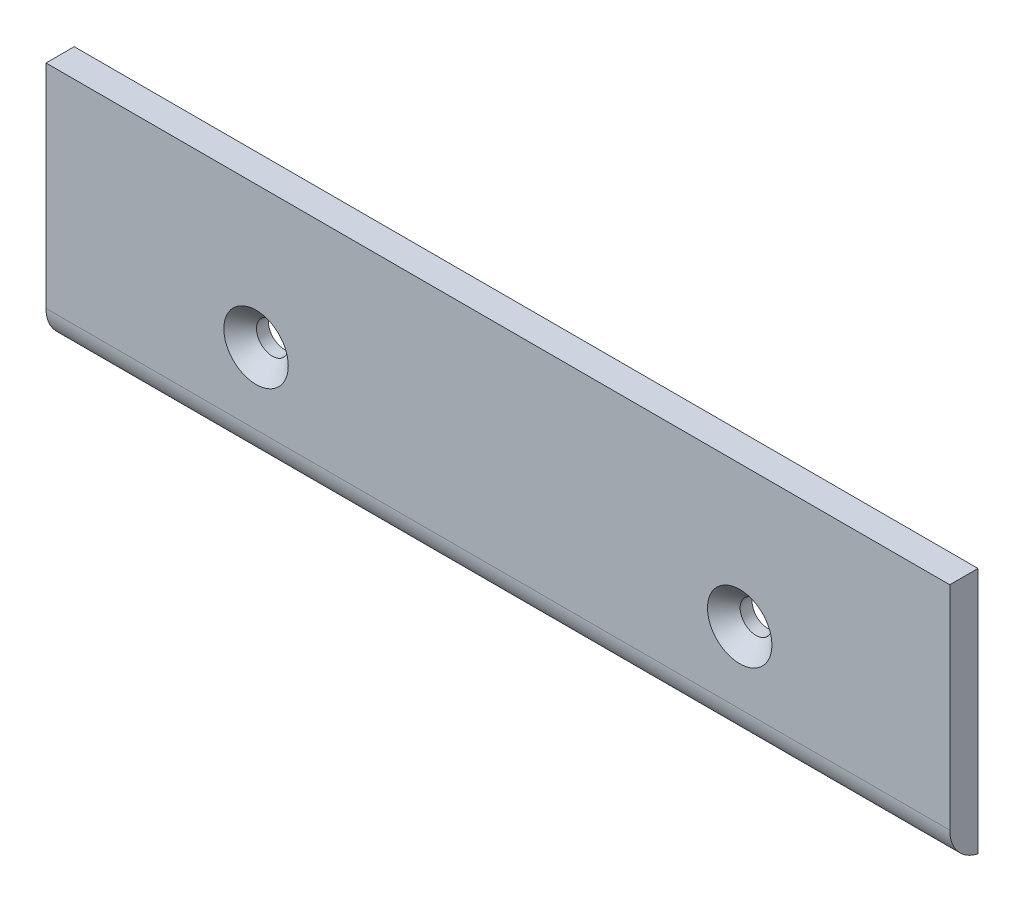
ISO-10303-21;
HEADER;
FILE_DESCRIPTION(('STEP AP214'),'2;1');
FILE_NAME('part.step','',(''),(''),'','','');
FILE_SCHEMA(('AUTOMOTIVE_DESIGN { 1 0 10303 214 1 1 1 1 }'));
ENDSEC;
DATA;
#1=APPLICATION_CONTEXT('core data for automotive mechanical design processes');
#2=APPLICATION_PROTOCOL_DEFINITION('international standard','automotive_design',2000,#1);
#3=PRODUCT_CONTEXT('',#1,'mechanical');
#4=PRODUCT('Part','Part','',(#3));
#5=PRODUCT_RELATED_PRODUCT_CATEGORY('part','',(#4));
#6=PRODUCT_DEFINITION_FORMATION('','',#4);
#7=PRODUCT_DEFINITION_CONTEXT('part definition',#1,'design');
#8=PRODUCT_DEFINITION('design','',#6,#7);
#9=PRODUCT_DEFINITION_SHAPE('','',#8);
#10=(LENGTH_UNIT() NAMED_UNIT(*) SI_UNIT(.MILLI.,.METRE.));
#11=(NAMED_UNIT(*) PLANE_ANGLE_UNIT() SI_UNIT($,.RADIAN.));
#12=(NAMED_UNIT(*) SI_UNIT($,.STERADIAN.) SOLID_ANGLE_UNIT());
#13=UNCERTAINTY_MEASURE_WITH_UNIT(LENGTH_MEASURE(1.E-05),#10,'distance_accuracy_value','');
#14=(GEOMETRIC_REPRESENTATION_CONTEXT(3) GLOBAL_UNCERTAINTY_ASSIGNED_CONTEXT((#13)) GLOBAL_UNIT_ASSIGNED_CONTEXT((#10,
#11,#12)) REPRESENTATION_CONTEXT('',''));
#15=CARTESIAN_POINT('',(0.,0.,0.));
#16=DIRECTION('',(0.,0.,1.));
#17=DIRECTION('',(1.,0.,0.));
#18=AXIS2_PLACEMENT_3D('',#15,#16,#17);
#19=CARTESIAN_POINT('',(-128.,-35.,-4.));
#20=DIRECTION('',(1.,0.,0.));
#21=DIRECTION('',(0.,-1.,0.));
#22=AXIS2_PLACEMENT_3D('',#19,#20,#21);
#23=PLANE('',#22);
#24=DIRECTION('',(0.,-1.,0.));
#25=VECTOR('',#24,1.);
#26=CARTESIAN_POINT('',(-128.,-35.,-4.));
#27=LINE('',#26,#25);
#28=CARTESIAN_POINT('',(-128.,35.,-4.));
#29=VERTEX_POINT('',#28);
#30=CARTESIAN_POINT('',(-128.,-35.,-4.));
#31=VERTEX_POINT('',#30);
#32=EDGE_CURVE('E99',#29,#31,#27,.T.);
#33=ORIENTED_EDGE('',*,*,#32,.T.);
#34=CARTESIAN_POINT('',(-128.,-25.2020410288673,-6.));
#35=DIRECTION('',(1.,0.,0.));
#36=DIRECTION('',(0.,0.,-1.));
#37=AXIS2_PLACEMENT_3D('',#34,#35,#36);
#38=CIRCLE('',#37,10.);
#39=CARTESIAN_POINT('',(-128.,-25.2020410288673,4.));
#40=VERTEX_POINT('',#39);
#41=EDGE_CURVE('E11',#31,#40,#38,.F.);
#42=ORIENTED_EDGE('',*,*,#41,.T.);
#43=DIRECTION('',(0.,1.,0.));
#44=VECTOR('',#43,1.);
#45=CARTESIAN_POINT('',(-128.,0.,4.));
#46=LINE('',#45,#44);
#47=CARTESIAN_POINT('',(-128.,35.,4.));
#48=VERTEX_POINT('',#47);
#49=EDGE_CURVE('E107',#48,#40,#46,.F.);
#50=ORIENTED_EDGE('',*,*,#49,.F.);
#51=DIRECTION('',(0.,0.,-1.));
#52=VECTOR('',#51,1.);
#53=CARTESIAN_POINT('',(-128.,35.,-4.));
#54=LINE('',#53,#52);
#55=EDGE_CURVE('E113',#48,#29,#54,.T.);
#56=ORIENTED_EDGE('',*,*,#55,.T.);
#57=EDGE_LOOP('',(#33,#42,#50,#56));
#58=FACE_BOUND('',#57,.T.);
#59=ADVANCED_FACE('F43',(#58),#23,.F.);
#60=CARTESIAN_POINT('',(-128.,35.,-4.));
#61=DIRECTION('',(0.,-1.,0.));
#62=DIRECTION('',(-1.,0.,0.));
#63=AXIS2_PLACEMENT_3D('',#60,#61,#62);
#64=PLANE('',#63);
#65=ORIENTED_EDGE('',*,*,#55,.F.);
#66=DIRECTION('',(-1.,0.,0.));
#67=VECTOR('',#66,1.);
#68=CARTESIAN_POINT('',(0.,35.,4.));
#69=LINE('',#68,#67);
#70=CARTESIAN_POINT('',(128.,35.,4.));
#71=VERTEX_POINT('',#70);
#72=EDGE_CURVE('E97',#71,#48,#69,.T.);
#73=ORIENTED_EDGE('',*,*,#72,.F.);
#74=DIRECTION('',(0.,0.,-1.));
#75=VECTOR('',#74,1.);
#76=CARTESIAN_POINT('',(128.,35.,-4.));
#77=LINE('',#76,#75);
#78=CARTESIAN_POINT('',(128.,35.,-4.));
#79=VERTEX_POINT('',#78);
#80=EDGE_CURVE('E105',#71,#79,#77,.T.);
#81=ORIENTED_EDGE('',*,*,#80,.T.);
#82=DIRECTION('',(-1.,0.,0.));
#83=VECTOR('',#82,1.);
#84=CARTESIAN_POINT('',(-128.,35.,-4.));
#85=LINE('',#84,#83);
#86=EDGE_CURVE('E96',#79,#29,#85,.T.);
#87=ORIENTED_EDGE('',*,*,#86,.T.);
#88=EDGE_LOOP('',(#65,#73,#81,#87));
#89=FACE_BOUND('',#88,.T.);
#90=ADVANCED_FACE('F119',(#89),#64,.F.);
#91=CARTESIAN_POINT('',(128.,-35.,-4.));
#92=DIRECTION('',(-1.,0.,0.));
#93=DIRECTION('',(0.,1.,0.));
#94=AXIS2_PLACEMENT_3D('',#91,#92,#93);
#95=PLANE('',#94);
#96=DIRECTION('',(0.,1.,0.));
#97=VECTOR('',#96,1.);
#98=CARTESIAN_POINT('',(128.,0.,4.));
#99=LINE('',#98,#97);
#100=CARTESIAN_POINT('',(128.,-25.2020410288673,4.));
#101=VERTEX_POINT('',#100);
#102=EDGE_CURVE('E89',#101,#71,#99,.T.);
#103=ORIENTED_EDGE('',*,*,#102,.F.);
#104=CARTESIAN_POINT('',(128.,-25.2020410288673,-6.));
#105=DIRECTION('',(-1.,0.,0.));
#106=DIRECTION('',(0.,0.,1.));
#107=AXIS2_PLACEMENT_3D('',#104,#105,#106);
#108=CIRCLE('',#107,10.);
#109=CARTESIAN_POINT('',(128.,-35.,-4.));
#110=VERTEX_POINT('',#109);
#111=EDGE_CURVE('E51',#101,#110,#108,.F.);
#112=ORIENTED_EDGE('',*,*,#111,.T.);
#113=DIRECTION('',(0.,1.,0.));
#114=VECTOR('',#113,1.);
#115=CARTESIAN_POINT('',(128.,-35.,-4.));
#116=LINE('',#115,#114);
#117=EDGE_CURVE('E87',#110,#79,#116,.T.);
#118=ORIENTED_EDGE('',*,*,#117,.T.);
#119=ORIENTED_EDGE('',*,*,#80,.F.);
#120=EDGE_LOOP('',(#103,#112,#118,#119));
#121=FACE_BOUND('',#120,.T.);
#122=ADVANCED_FACE('F85',(#121),#95,.F.);
#123=CARTESIAN_POINT('',(0.,0.,-4.));
#124=DIRECTION('',(0.,0.,-1.));
#125=DIRECTION('',(-1.,0.,0.));
#126=AXIS2_PLACEMENT_3D('',#123,#124,#125);
#127=PLANE('',#126);
#128=CARTESIAN_POINT('',(68.5,-5.,-4.));
#129=DIRECTION('',(0.,0.,1.));
#130=DIRECTION('',(1.,0.,0.));
#131=AXIS2_PLACEMENT_3D('',#128,#129,#130);
#132=CIRCLE('',#131,4.5);
#133=CARTESIAN_POINT('',(73.,-5.,-4.));
#134=VERTEX_POINT('',#133);
#135=EDGE_CURVE('E159',#134,#134,#132,.T.);
#136=ORIENTED_EDGE('',*,*,#135,.T.);
#137=EDGE_LOOP('',(#136));
#138=FACE_BOUND('',#137,.T.);
#139=CARTESIAN_POINT('',(-68.5,-5.,-4.));
#140=DIRECTION('',(0.,0.,1.));
#141=DIRECTION('',(1.,0.,0.));
#142=AXIS2_PLACEMENT_3D('',#139,#140,#141);
#143=CIRCLE('',#142,4.5);
#144=CARTESIAN_POINT('',(-64.,-5.,-4.));
#145=VERTEX_POINT('',#144);
#146=EDGE_CURVE('E108',#145,#145,#143,.T.);
#147=ORIENTED_EDGE('',*,*,#146,.T.);
#148=EDGE_LOOP('',(#147));
#149=FACE_BOUND('',#148,.T.);
#150=ORIENTED_EDGE('',*,*,#117,.F.);
#151=DIRECTION('',(1.,0.,0.));
#152=VECTOR('',#151,1.);
#153=CARTESIAN_POINT('',(-128.,-35.,-4.));
#154=LINE('',#153,#152);
#155=EDGE_CURVE('E94',#31,#110,#154,.T.);
#156=ORIENTED_EDGE('',*,*,#155,.F.);
#157=ORIENTED_EDGE('',*,*,#32,.F.);
#158=ORIENTED_EDGE('',*,*,#86,.F.);
#159=EDGE_LOOP('',(#150,#156,#157,#158));
#160=FACE_BOUND('',#159,.T.);
#161=ADVANCED_FACE('F92',(#138,#149,#160),#127,.T.);
#162=CARTESIAN_POINT('',(0.,0.,4.));
#163=DIRECTION('',(0.,0.,-1.));
#164=DIRECTION('',(-1.,0.,0.));
#165=AXIS2_PLACEMENT_3D('',#162,#163,#164);
#166=PLANE('',#165);
#167=CARTESIAN_POINT('',(68.5,-5.,4.));
#168=DIRECTION('',(0.,0.,1.));
#169=DIRECTION('',(1.,0.,0.));
#170=AXIS2_PLACEMENT_3D('',#167,#168,#169);
#171=CIRCLE('',#170,9.12499999999999);
#172=CARTESIAN_POINT('',(77.625,-5.,4.));
#173=VERTEX_POINT('',#172);
#174=EDGE_CURVE('E157',#173,#173,#171,.T.);
#175=ORIENTED_EDGE('',*,*,#174,.F.);
#176=EDGE_LOOP('',(#175));
#177=FACE_BOUND('',#176,.T.);
#178=CARTESIAN_POINT('',(-68.5,-5.,4.));
#179=DIRECTION('',(0.,0.,1.));
#180=DIRECTION('',(1.,0.,0.));
#181=AXIS2_PLACEMENT_3D('',#178,#179,#180);
#182=CIRCLE('',#181,9.125);
#183=CARTESIAN_POINT('',(-59.375,-5.,4.));
#184=VERTEX_POINT('',#183);
#185=EDGE_CURVE('E164',#184,#184,#182,.T.);
#186=ORIENTED_EDGE('',*,*,#185,.F.);
#187=EDGE_LOOP('',(#186));
#188=FACE_BOUND('',#187,.T.);
#189=ORIENTED_EDGE('',*,*,#49,.T.);
#190=DIRECTION('',(-1.,0.,0.));
#191=VECTOR('',#190,1.);
#192=CARTESIAN_POINT('',(0.,-25.2020410288673,4.));
#193=LINE('',#192,#191);
#194=EDGE_CURVE('E90',#40,#101,#193,.F.);
#195=ORIENTED_EDGE('',*,*,#194,.T.);
#196=ORIENTED_EDGE('',*,*,#102,.T.);
#197=ORIENTED_EDGE('',*,*,#72,.T.);
#198=EDGE_LOOP('',(#189,#195,#196,#197));
#199=FACE_BOUND('',#198,.T.);
#200=ADVANCED_FACE('F116',(#177,#188,#199),#166,.F.);
#201=CARTESIAN_POINT('',(-128.,-25.2020410288673,-6.));
#202=DIRECTION('',(-1.,0.,0.));
#203=DIRECTION('',(0.,0.,1.));
#204=AXIS2_PLACEMENT_3D('',#201,#202,#203);
#205=CYLINDRICAL_SURFACE('',#204,10.);
#206=ORIENTED_EDGE('',*,*,#41,.F.);
#207=ORIENTED_EDGE('',*,*,#155,.T.);
#208=ORIENTED_EDGE('',*,*,#111,.F.);
#209=ORIENTED_EDGE('',*,*,#194,.F.);
#210=EDGE_LOOP('',(#206,#207,#208,#209));
#211=FACE_BOUND('',#210,.T.);
#212=ADVANCED_FACE('F45',(#211),#205,.T.);
#213=CARTESIAN_POINT('',(-68.5,-5.,4.));
#214=DIRECTION('',(0.,0.,1.));
#215=DIRECTION('',(1.,0.,0.));
#216=AXIS2_PLACEMENT_3D('',#213,#214,#215);
#217=CYLINDRICAL_SURFACE('',#216,4.5);
#218=ORIENTED_EDGE('',*,*,#146,.F.);
#219=EDGE_LOOP('',(#218));
#220=FACE_BOUND('',#219,.T.);
#221=CARTESIAN_POINT('',(-68.5,-5.,-0.625000000000002));
#222=DIRECTION('',(0.,0.,1.));
#223=DIRECTION('',(1.,0.,0.));
#224=AXIS2_PLACEMENT_3D('',#221,#222,#223);
#225=CIRCLE('',#224,4.5);
#226=CARTESIAN_POINT('',(-64.,-5.,-0.625000000000002));
#227=VERTEX_POINT('',#226);
#228=EDGE_CURVE('E167',#227,#227,#225,.T.);
#229=ORIENTED_EDGE('',*,*,#228,.T.);
#230=EDGE_LOOP('',(#229));
#231=FACE_BOUND('',#230,.T.);
#232=ADVANCED_FACE('F134',(#220,#231),#217,.F.);
#233=CARTESIAN_POINT('',(-68.5,-5.,4.));
#234=DIRECTION('',(0.,0.,1.));
#235=DIRECTION('',(1.,0.,0.));
#236=AXIS2_PLACEMENT_3D('',#233,#234,#235);
#237=CONICAL_SURFACE('',#236,9.125,0.785398163397448);
#238=ORIENTED_EDGE('',*,*,#228,.F.);
#239=EDGE_LOOP('',(#238));
#240=FACE_BOUND('',#239,.T.);
#241=ORIENTED_EDGE('',*,*,#185,.T.);
#242=EDGE_LOOP('',(#241));
#243=FACE_BOUND('',#242,.T.);
#244=ADVANCED_FACE('F137',(#240,#243),#237,.F.);
#245=CARTESIAN_POINT('',(68.5,-5.,4.));
#246=DIRECTION('',(0.,0.,1.));
#247=DIRECTION('',(1.,0.,0.));
#248=AXIS2_PLACEMENT_3D('',#245,#246,#247);
#249=CYLINDRICAL_SURFACE('',#248,4.5);
#250=ORIENTED_EDGE('',*,*,#135,.F.);
#251=EDGE_LOOP('',(#250));
#252=FACE_BOUND('',#251,.T.);
#253=CARTESIAN_POINT('',(68.5,-5.,-0.625000000000002));
#254=DIRECTION('',(0.,0.,1.));
#255=DIRECTION('',(1.,0.,0.));
#256=AXIS2_PLACEMENT_3D('',#253,#254,#255);
#257=CIRCLE('',#256,4.5);
#258=CARTESIAN_POINT('',(73.,-5.,-0.625000000000002));
#259=VERTEX_POINT('',#258);
#260=EDGE_CURVE('E154',#259,#259,#257,.T.);
#261=ORIENTED_EDGE('',*,*,#260,.T.);
#262=EDGE_LOOP('',(#261));
#263=FACE_BOUND('',#262,.T.);
#264=ADVANCED_FACE('F141',(#252,#263),#249,.F.);
#265=CARTESIAN_POINT('',(68.5,-5.,4.));
#266=DIRECTION('',(0.,0.,1.));
#267=DIRECTION('',(1.,0.,0.));
#268=AXIS2_PLACEMENT_3D('',#265,#266,#267);
#269=CONICAL_SURFACE('',#268,9.12499999999999,0.785398163397447);
#270=ORIENTED_EDGE('',*,*,#260,.F.);
#271=EDGE_LOOP('',(#270));
#272=FACE_BOUND('',#271,.T.);
#273=ORIENTED_EDGE('',*,*,#174,.T.);
#274=EDGE_LOOP('',(#273));
#275=FACE_BOUND('',#274,.T.);
#276=ADVANCED_FACE('F145',(#272,#275),#269,.F.);
#277=CLOSED_SHELL('',(#59,#90,#122,#161,#200,#212,#232,#244,#264,#276));
#278=MANIFOLD_SOLID_BREP('B2',#277);
#279=ADVANCED_BREP_SHAPE_REPRESENTATION('',(#18,#278),#14);
#280=SHAPE_DEFINITION_REPRESENTATION(#9,#279);
ENDSEC;
END-ISO-10303-21;
